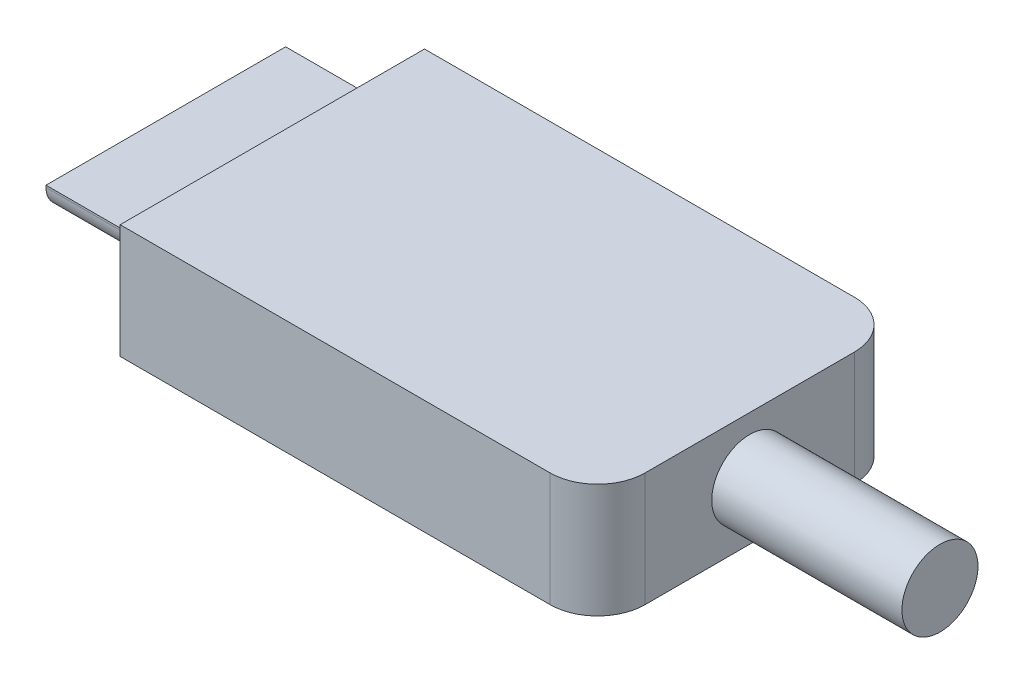
ISO-10303-21;
HEADER;
FILE_DESCRIPTION(('STEP AP214'),'2;1');
FILE_NAME('part.step','',(''),(''),'','','');
FILE_SCHEMA(('AUTOMOTIVE_DESIGN { 1 0 10303 214 1 1 1 1 }'));
ENDSEC;
DATA;
#1=APPLICATION_CONTEXT('core data for automotive mechanical design processes');
#2=APPLICATION_PROTOCOL_DEFINITION('international standard','automotive_design',2000,#1);
#3=PRODUCT_CONTEXT('',#1,'mechanical');
#4=PRODUCT('Part','Part','',(#3));
#5=PRODUCT_RELATED_PRODUCT_CATEGORY('part','',(#4));
#6=PRODUCT_DEFINITION_FORMATION('','',#4);
#7=PRODUCT_DEFINITION_CONTEXT('part definition',#1,'design');
#8=PRODUCT_DEFINITION('design','',#6,#7);
#9=PRODUCT_DEFINITION_SHAPE('','',#8);
#10=(LENGTH_UNIT() NAMED_UNIT(*) SI_UNIT(.MILLI.,.METRE.));
#11=(NAMED_UNIT(*) PLANE_ANGLE_UNIT() SI_UNIT($,.RADIAN.));
#12=(NAMED_UNIT(*) SI_UNIT($,.STERADIAN.) SOLID_ANGLE_UNIT());
#13=UNCERTAINTY_MEASURE_WITH_UNIT(LENGTH_MEASURE(1.E-05),#10,'distance_accuracy_value','');
#14=(GEOMETRIC_REPRESENTATION_CONTEXT(3) GLOBAL_UNCERTAINTY_ASSIGNED_CONTEXT((#13)) GLOBAL_UNIT_ASSIGNED_CONTEXT((#10,
#11,#12)) REPRESENTATION_CONTEXT('',''));
#15=CARTESIAN_POINT('',(0.,0.,0.));
#16=DIRECTION('',(0.,0.,1.));
#17=DIRECTION('',(1.,0.,0.));
#18=AXIS2_PLACEMENT_3D('',#15,#16,#17);
#19=CARTESIAN_POINT('',(-12.55,-3.,-8.));
#20=DIRECTION('',(-1.,0.,0.));
#21=DIRECTION('',(0.,0.,1.));
#22=AXIS2_PLACEMENT_3D('',#19,#20,#21);
#23=PLANE('',#22);
#24=DIRECTION('',(0.,1.,0.));
#25=VECTOR('',#24,1.);
#26=CARTESIAN_POINT('',(-12.55,-3.,8.));
#27=LINE('',#26,#25);
#28=CARTESIAN_POINT('',(-12.55,-3.,8.));
#29=VERTEX_POINT('',#28);
#30=CARTESIAN_POINT('',(-12.55,3.,8.));
#31=VERTEX_POINT('',#30);
#32=EDGE_CURVE('E37',#29,#31,#27,.T.);
#33=ORIENTED_EDGE('',*,*,#32,.T.);
#34=DIRECTION('',(0.,0.,1.));
#35=VECTOR('',#34,1.);
#36=CARTESIAN_POINT('',(-12.55,3.,-8.));
#37=LINE('',#36,#35);
#38=CARTESIAN_POINT('',(-12.55,3.,-8.));
#39=VERTEX_POINT('',#38);
#40=EDGE_CURVE('E400',#39,#31,#37,.T.);
#41=ORIENTED_EDGE('',*,*,#40,.F.);
#42=DIRECTION('',(0.,1.,0.));
#43=VECTOR('',#42,1.);
#44=CARTESIAN_POINT('',(-12.55,-3.,-8.));
#45=LINE('',#44,#43);
#46=CARTESIAN_POINT('',(-12.55,-3.,-8.));
#47=VERTEX_POINT('',#46);
#48=EDGE_CURVE('E11',#47,#39,#45,.T.);
#49=ORIENTED_EDGE('',*,*,#48,.F.);
#50=DIRECTION('',(0.,0.,1.));
#51=VECTOR('',#50,1.);
#52=CARTESIAN_POINT('',(-12.55,-3.,-8.));
#53=LINE('',#52,#51);
#54=EDGE_CURVE('E418',#47,#29,#53,.T.);
#55=ORIENTED_EDGE('',*,*,#54,.T.);
#56=EDGE_LOOP('',(#33,#41,#49,#55));
#57=FACE_BOUND('',#56,.T.);
#58=DIRECTION('',(0.,1.,0.));
#59=VECTOR('',#58,1.);
#60=CARTESIAN_POINT('',(-12.55,1.0446453128218,6.30000000000001));
#61=LINE('',#60,#59);
#62=CARTESIAN_POINT('',(-12.55,1.0446453128218,6.30000000000001));
#63=VERTEX_POINT('',#62);
#64=CARTESIAN_POINT('',(-12.55,1.15,6.3));
#65=VERTEX_POINT('',#64);
#66=EDGE_CURVE('E347',#63,#65,#61,.T.);
#67=ORIENTED_EDGE('',*,*,#66,.F.);
#68=CARTESIAN_POINT('',(-12.55,1.0446453128218,5.1));
#69=DIRECTION('',(-1.,0.,0.));
#70=DIRECTION('',(0.,0.,-1.));
#71=AXIS2_PLACEMENT_3D('',#68,#69,#70);
#72=CIRCLE('',#71,1.2);
#73=CARTESIAN_POINT('',(-12.55,0.196117175397943,5.94852813742386));
#74=VERTEX_POINT('',#73);
#75=EDGE_CURVE('E244',#74,#63,#72,.T.);
#76=ORIENTED_EDGE('',*,*,#75,.F.);
#77=DIRECTION('',(0.,0.707106781186547,0.707106781186548));
#78=VECTOR('',#77,1.);
#79=CARTESIAN_POINT('',(-12.55,-0.798528137423859,4.95388282460206));
#80=LINE('',#79,#78);
#81=CARTESIAN_POINT('',(-12.55,-0.798528137423855,4.95388282460206));
#82=VERTEX_POINT('',#81);
#83=EDGE_CURVE('E322',#82,#74,#80,.T.);
#84=ORIENTED_EDGE('',*,*,#83,.F.);
#85=CARTESIAN_POINT('',(-12.55,0.0499999999999997,4.1053546871782));
#86=DIRECTION('',(-1.,0.,0.));
#87=DIRECTION('',(0.,0.,-1.));
#88=AXIS2_PLACEMENT_3D('',#85,#86,#87);
#89=CIRCLE('',#88,1.2);
#90=CARTESIAN_POINT('',(-12.55,-1.15,4.1053546871782));
#91=VERTEX_POINT('',#90);
#92=EDGE_CURVE('E365',#91,#82,#89,.T.);
#93=ORIENTED_EDGE('',*,*,#92,.F.);
#94=DIRECTION('',(0.,0.,1.));
#95=VECTOR('',#94,1.);
#96=CARTESIAN_POINT('',(-12.55,-1.15,0.912741699796952));
#97=LINE('',#96,#95);
#98=CARTESIAN_POINT('',(-12.55,-1.15,0.912741699796952));
#99=VERTEX_POINT('',#98);
#100=EDGE_CURVE('E363',#99,#91,#97,.T.);
#101=ORIENTED_EDGE('',*,*,#100,.F.);
#102=CARTESIAN_POINT('',(-12.55,0.0499999999999988,0.912741699796952));
#103=DIRECTION('',(-1.,0.,0.));
#104=DIRECTION('',(0.,0.,-1.));
#105=AXIS2_PLACEMENT_3D('',#102,#103,#104);
#106=CIRCLE('',#105,1.2);
#107=CARTESIAN_POINT('',(-12.55,-0.798528137423859,0.0642135623730962));
#108=VERTEX_POINT('',#107);
#109=EDGE_CURVE('E361',#108,#99,#106,.T.);
#110=ORIENTED_EDGE('',*,*,#109,.F.);
#111=DIRECTION('',(0.,-0.707106781186547,0.707106781186548));
#112=VECTOR('',#111,1.);
#113=CARTESIAN_POINT('',(-12.55,-0.798528137423859,0.0642135623730962));
#114=LINE('',#113,#112);
#115=CARTESIAN_POINT('',(-12.55,-0.057322330470338,-0.676992244580426));
#116=VERTEX_POINT('',#115);
#117=EDGE_CURVE('E359',#116,#108,#114,.T.);
#118=ORIENTED_EDGE('',*,*,#117,.F.);
#119=CARTESIAN_POINT('',(-12.55,-0.605330085889914,-1.225));
#120=DIRECTION('',(1.,0.,0.));
#121=DIRECTION('',(0.,0.,-1.));
#122=AXIS2_PLACEMENT_3D('',#119,#120,#121);
#123=CIRCLE('',#122,0.775);
#124=CARTESIAN_POINT('',(-12.55,-0.605330085889914,-2.));
#125=VERTEX_POINT('',#124);
#126=EDGE_CURVE('E357',#125,#116,#123,.T.);
#127=ORIENTED_EDGE('',*,*,#126,.F.);
#128=DIRECTION('',(0.,1.,0.));
#129=VECTOR('',#128,1.);
#130=CARTESIAN_POINT('',(-12.55,-1.15,-2.));
#131=LINE('',#130,#129);
#132=CARTESIAN_POINT('',(-12.55,-1.15,-2.));
#133=VERTEX_POINT('',#132);
#134=EDGE_CURVE('E355',#133,#125,#131,.T.);
#135=ORIENTED_EDGE('',*,*,#134,.F.);
#136=DIRECTION('',(0.,0.,1.));
#137=VECTOR('',#136,1.);
#138=CARTESIAN_POINT('',(-12.55,-1.15,-6.3));
#139=LINE('',#138,#137);
#140=CARTESIAN_POINT('',(-12.55,-1.15,-6.3));
#141=VERTEX_POINT('',#140);
#142=EDGE_CURVE('E353',#141,#133,#139,.T.);
#143=ORIENTED_EDGE('',*,*,#142,.F.);
#144=DIRECTION('',(0.,-1.,0.));
#145=VECTOR('',#144,1.);
#146=CARTESIAN_POINT('',(-12.55,1.15,-6.3));
#147=LINE('',#146,#145);
#148=CARTESIAN_POINT('',(-12.55,1.15,-6.3));
#149=VERTEX_POINT('',#148);
#150=EDGE_CURVE('E351',#149,#141,#147,.T.);
#151=ORIENTED_EDGE('',*,*,#150,.F.);
#152=DIRECTION('',(0.,0.,-1.));
#153=VECTOR('',#152,1.);
#154=CARTESIAN_POINT('',(-12.55,1.15,6.3));
#155=LINE('',#154,#153);
#156=EDGE_CURVE('E349',#65,#149,#155,.T.);
#157=ORIENTED_EDGE('',*,*,#156,.F.);
#158=EDGE_LOOP('',(#67,#76,#84,#93,#101,#110,#118,#127,#135,#143,#151,#157));
#159=FACE_BOUND('',#158,.T.);
#160=ADVANCED_FACE('F33',(#57,#159),#23,.T.);
#161=CARTESIAN_POINT('',(-12.55,-3.,-8.));
#162=DIRECTION('',(0.,0.,-1.));
#163=DIRECTION('',(-1.,0.,0.));
#164=AXIS2_PLACEMENT_3D('',#161,#162,#163);
#165=PLANE('',#164);
#166=ORIENTED_EDGE('',*,*,#48,.T.);
#167=DIRECTION('',(-1.,0.,0.));
#168=VECTOR('',#167,1.);
#169=CARTESIAN_POINT('',(-12.55,3.,-8.));
#170=LINE('',#169,#168);
#171=CARTESIAN_POINT('',(10.05,3.,-8.));
#172=VERTEX_POINT('',#171);
#173=EDGE_CURVE('E415',#172,#39,#170,.T.);
#174=ORIENTED_EDGE('',*,*,#173,.F.);
#175=DIRECTION('',(0.,1.,0.));
#176=VECTOR('',#175,1.);
#177=CARTESIAN_POINT('',(10.05,-3.,-8.));
#178=LINE('',#177,#176);
#179=CARTESIAN_POINT('',(10.05,-3.,-8.));
#180=VERTEX_POINT('',#179);
#181=EDGE_CURVE('E42',#180,#172,#178,.T.);
#182=ORIENTED_EDGE('',*,*,#181,.F.);
#183=DIRECTION('',(-1.,0.,0.));
#184=VECTOR('',#183,1.);
#185=CARTESIAN_POINT('',(-12.55,-3.,-8.));
#186=LINE('',#185,#184);
#187=EDGE_CURVE('E433',#180,#47,#186,.T.);
#188=ORIENTED_EDGE('',*,*,#187,.T.);
#189=EDGE_LOOP('',(#166,#174,#182,#188));
#190=FACE_BOUND('',#189,.T.);
#191=ADVANCED_FACE('F455',(#190),#165,.T.);
#192=CARTESIAN_POINT('',(10.05,-3.,-5.5));
#193=DIRECTION('',(0.,1.,0.));
#194=DIRECTION('',(0.,0.,1.));
#195=AXIS2_PLACEMENT_3D('',#192,#193,#194);
#196=CYLINDRICAL_SURFACE('',#195,2.5);
#197=ORIENTED_EDGE('',*,*,#181,.T.);
#198=CARTESIAN_POINT('',(10.05,3.,-5.5));
#199=DIRECTION('',(0.,1.,0.));
#200=DIRECTION('',(0.,0.,-1.));
#201=AXIS2_PLACEMENT_3D('',#198,#199,#200);
#202=CIRCLE('',#201,2.5);
#203=CARTESIAN_POINT('',(12.55,3.,-5.5));
#204=VERTEX_POINT('',#203);
#205=EDGE_CURVE('E412',#204,#172,#202,.T.);
#206=ORIENTED_EDGE('',*,*,#205,.F.);
#207=DIRECTION('',(0.,1.,0.));
#208=VECTOR('',#207,1.);
#209=CARTESIAN_POINT('',(12.55,-3.,-5.5));
#210=LINE('',#209,#208);
#211=CARTESIAN_POINT('',(12.55,-3.,-5.5));
#212=VERTEX_POINT('',#211);
#213=EDGE_CURVE('E437',#212,#204,#210,.T.);
#214=ORIENTED_EDGE('',*,*,#213,.F.);
#215=CARTESIAN_POINT('',(10.05,-3.,-5.5));
#216=DIRECTION('',(0.,1.,0.));
#217=DIRECTION('',(0.,0.,-1.));
#218=AXIS2_PLACEMENT_3D('',#215,#216,#217);
#219=CIRCLE('',#218,2.5);
#220=EDGE_CURVE('E430',#212,#180,#219,.T.);
#221=ORIENTED_EDGE('',*,*,#220,.T.);
#222=EDGE_LOOP('',(#197,#206,#214,#221));
#223=FACE_BOUND('',#222,.T.);
#224=ADVANCED_FACE('F468',(#223),#196,.T.);
#225=CARTESIAN_POINT('',(12.55,-3.,-5.5));
#226=DIRECTION('',(1.,0.,0.));
#227=DIRECTION('',(0.,0.,-1.));
#228=AXIS2_PLACEMENT_3D('',#225,#226,#227);
#229=PLANE('',#228);
#230=CARTESIAN_POINT('',(12.55,0.,0.));
#231=DIRECTION('',(1.,0.,0.));
#232=DIRECTION('',(0.,0.,-1.));
#233=AXIS2_PLACEMENT_3D('',#230,#231,#232);
#234=CIRCLE('',#233,2.);
#235=CARTESIAN_POINT('',(12.55,0.,-2.));
#236=VERTEX_POINT('',#235);
#237=EDGE_CURVE('E624',#236,#236,#234,.T.);
#238=ORIENTED_EDGE('',*,*,#237,.F.);
#239=EDGE_LOOP('',(#238));
#240=FACE_BOUND('',#239,.T.);
#241=ORIENTED_EDGE('',*,*,#213,.T.);
#242=DIRECTION('',(0.,0.,-1.));
#243=VECTOR('',#242,1.);
#244=CARTESIAN_POINT('',(12.55,3.,-5.5));
#245=LINE('',#244,#243);
#246=CARTESIAN_POINT('',(12.55,3.,5.5));
#247=VERTEX_POINT('',#246);
#248=EDGE_CURVE('E409',#247,#204,#245,.T.);
#249=ORIENTED_EDGE('',*,*,#248,.F.);
#250=DIRECTION('',(0.,1.,0.));
#251=VECTOR('',#250,1.);
#252=CARTESIAN_POINT('',(12.55,-3.,5.5));
#253=LINE('',#252,#251);
#254=CARTESIAN_POINT('',(12.55,-3.,5.5));
#255=VERTEX_POINT('',#254);
#256=EDGE_CURVE('E439',#255,#247,#253,.T.);
#257=ORIENTED_EDGE('',*,*,#256,.F.);
#258=DIRECTION('',(0.,0.,-1.));
#259=VECTOR('',#258,1.);
#260=CARTESIAN_POINT('',(12.55,-3.,-5.5));
#261=LINE('',#260,#259);
#262=EDGE_CURVE('E427',#255,#212,#261,.T.);
#263=ORIENTED_EDGE('',*,*,#262,.T.);
#264=EDGE_LOOP('',(#241,#249,#257,#263));
#265=FACE_BOUND('',#264,.T.);
#266=ADVANCED_FACE('F466',(#240,#265),#229,.T.);
#267=CARTESIAN_POINT('',(10.05,-3.,5.5));
#268=DIRECTION('',(0.,1.,0.));
#269=DIRECTION('',(0.,0.,1.));
#270=AXIS2_PLACEMENT_3D('',#267,#268,#269);
#271=CYLINDRICAL_SURFACE('',#270,2.5);
#272=ORIENTED_EDGE('',*,*,#256,.T.);
#273=CARTESIAN_POINT('',(10.05,3.,5.5));
#274=DIRECTION('',(0.,1.,0.));
#275=DIRECTION('',(0.,0.,1.));
#276=AXIS2_PLACEMENT_3D('',#273,#274,#275);
#277=CIRCLE('',#276,2.5);
#278=CARTESIAN_POINT('',(10.05,3.,8.));
#279=VERTEX_POINT('',#278);
#280=EDGE_CURVE('E406',#279,#247,#277,.T.);
#281=ORIENTED_EDGE('',*,*,#280,.F.);
#282=DIRECTION('',(0.,1.,0.));
#283=VECTOR('',#282,1.);
#284=CARTESIAN_POINT('',(10.05,-3.,8.));
#285=LINE('',#284,#283);
#286=CARTESIAN_POINT('',(10.05,-3.,8.));
#287=VERTEX_POINT('',#286);
#288=EDGE_CURVE('E440',#287,#279,#285,.T.);
#289=ORIENTED_EDGE('',*,*,#288,.F.);
#290=CARTESIAN_POINT('',(10.05,-3.,5.5));
#291=DIRECTION('',(0.,1.,0.));
#292=DIRECTION('',(0.,0.,1.));
#293=AXIS2_PLACEMENT_3D('',#290,#291,#292);
#294=CIRCLE('',#293,2.5);
#295=EDGE_CURVE('E424',#287,#255,#294,.T.);
#296=ORIENTED_EDGE('',*,*,#295,.T.);
#297=EDGE_LOOP('',(#272,#281,#289,#296));
#298=FACE_BOUND('',#297,.T.);
#299=ADVANCED_FACE('F463',(#298),#271,.T.);
#300=CARTESIAN_POINT('',(-12.55,-3.,8.));
#301=DIRECTION('',(0.,0.,1.));
#302=DIRECTION('',(1.,0.,0.));
#303=AXIS2_PLACEMENT_3D('',#300,#301,#302);
#304=PLANE('',#303);
#305=ORIENTED_EDGE('',*,*,#288,.T.);
#306=DIRECTION('',(1.,0.,0.));
#307=VECTOR('',#306,1.);
#308=CARTESIAN_POINT('',(-12.55,3.,8.));
#309=LINE('',#308,#307);
#310=EDGE_CURVE('E403',#31,#279,#309,.T.);
#311=ORIENTED_EDGE('',*,*,#310,.F.);
#312=ORIENTED_EDGE('',*,*,#32,.F.);
#313=DIRECTION('',(1.,0.,0.));
#314=VECTOR('',#313,1.);
#315=CARTESIAN_POINT('',(-12.55,-3.,8.));
#316=LINE('',#315,#314);
#317=EDGE_CURVE('E421',#29,#287,#316,.T.);
#318=ORIENTED_EDGE('',*,*,#317,.T.);
#319=EDGE_LOOP('',(#305,#311,#312,#318));
#320=FACE_BOUND('',#319,.T.);
#321=ADVANCED_FACE('F448',(#320),#304,.T.);
#322=CARTESIAN_POINT('',(10.05,-3.,5.5));
#323=DIRECTION('',(0.,1.,0.));
#324=DIRECTION('',(0.,0.,1.));
#325=AXIS2_PLACEMENT_3D('',#322,#323,#324);
#326=PLANE('',#325);
#327=ORIENTED_EDGE('',*,*,#54,.F.);
#328=ORIENTED_EDGE('',*,*,#187,.F.);
#329=ORIENTED_EDGE('',*,*,#220,.F.);
#330=ORIENTED_EDGE('',*,*,#262,.F.);
#331=ORIENTED_EDGE('',*,*,#295,.F.);
#332=ORIENTED_EDGE('',*,*,#317,.F.);
#333=EDGE_LOOP('',(#327,#328,#329,#330,#331,#332));
#334=FACE_BOUND('',#333,.T.);
#335=ADVANCED_FACE('F458',(#334),#326,.F.);
#336=CARTESIAN_POINT('',(10.05,3.,5.5));
#337=DIRECTION('',(0.,1.,0.));
#338=DIRECTION('',(0.,0.,1.));
#339=AXIS2_PLACEMENT_3D('',#336,#337,#338);
#340=PLANE('',#339);
#341=ORIENTED_EDGE('',*,*,#40,.T.);
#342=ORIENTED_EDGE('',*,*,#310,.T.);
#343=ORIENTED_EDGE('',*,*,#280,.T.);
#344=ORIENTED_EDGE('',*,*,#248,.T.);
#345=ORIENTED_EDGE('',*,*,#205,.T.);
#346=ORIENTED_EDGE('',*,*,#173,.T.);
#347=EDGE_LOOP('',(#341,#342,#343,#344,#345,#346));
#348=FACE_BOUND('',#347,.T.);
#349=ADVANCED_FACE('F451',(#348),#340,.T.);
#350=CARTESIAN_POINT('',(-18.15,1.0446453128218,5.1));
#351=DIRECTION('',(1.,0.,0.));
#352=DIRECTION('',(0.,0.,-1.));
#353=AXIS2_PLACEMENT_3D('',#350,#351,#352);
#354=PLANE('',#353);
#355=CARTESIAN_POINT('',(-18.15,1.0446453128218,5.1));
#356=DIRECTION('',(-1.,0.,0.));
#357=DIRECTION('',(0.,0.,-1.));
#358=AXIS2_PLACEMENT_3D('',#355,#356,#357);
#359=CIRCLE('',#358,1.2);
#360=CARTESIAN_POINT('',(-18.15,0.196117175397943,5.94852813742386));
#361=VERTEX_POINT('',#360);
#362=CARTESIAN_POINT('',(-18.15,1.0446453128218,6.30000000000001));
#363=VERTEX_POINT('',#362);
#364=EDGE_CURVE('E318',#361,#363,#359,.T.);
#365=ORIENTED_EDGE('',*,*,#364,.T.);
#366=DIRECTION('',(0.,1.,0.));
#367=VECTOR('',#366,1.);
#368=CARTESIAN_POINT('',(-18.15,1.0446453128218,6.30000000000001));
#369=LINE('',#368,#367);
#370=CARTESIAN_POINT('',(-18.15,1.15,6.30000000000001));
#371=VERTEX_POINT('',#370);
#372=EDGE_CURVE('E321',#363,#371,#369,.T.);
#373=ORIENTED_EDGE('',*,*,#372,.T.);
#374=DIRECTION('',(0.,0.,-1.));
#375=VECTOR('',#374,1.);
#376=CARTESIAN_POINT('',(-18.15,1.15,6.30000000000001));
#377=LINE('',#376,#375);
#378=CARTESIAN_POINT('',(-18.15,1.15,-6.3));
#379=VERTEX_POINT('',#378);
#380=EDGE_CURVE('E324',#371,#379,#377,.T.);
#381=ORIENTED_EDGE('',*,*,#380,.T.);
#382=DIRECTION('',(0.,-1.,0.));
#383=VECTOR('',#382,1.);
#384=CARTESIAN_POINT('',(-18.15,1.15,-6.3));
#385=LINE('',#384,#383);
#386=CARTESIAN_POINT('',(-18.15,-1.15,-6.3));
#387=VERTEX_POINT('',#386);
#388=EDGE_CURVE('E326',#379,#387,#385,.T.);
#389=ORIENTED_EDGE('',*,*,#388,.T.);
#390=DIRECTION('',(0.,0.,1.));
#391=VECTOR('',#390,1.);
#392=CARTESIAN_POINT('',(-18.15,-1.15,-6.3));
#393=LINE('',#392,#391);
#394=CARTESIAN_POINT('',(-18.15,-1.15,-2.));
#395=VERTEX_POINT('',#394);
#396=EDGE_CURVE('E328',#387,#395,#393,.T.);
#397=ORIENTED_EDGE('',*,*,#396,.T.);
#398=DIRECTION('',(0.,1.,0.));
#399=VECTOR('',#398,1.);
#400=CARTESIAN_POINT('',(-18.15,-1.15,-2.));
#401=LINE('',#400,#399);
#402=CARTESIAN_POINT('',(-18.15,-0.605330085889914,-2.));
#403=VERTEX_POINT('',#402);
#404=EDGE_CURVE('E330',#395,#403,#401,.T.);
#405=ORIENTED_EDGE('',*,*,#404,.T.);
#406=CARTESIAN_POINT('',(-18.15,-0.605330085889914,-1.225));
#407=DIRECTION('',(1.,0.,0.));
#408=DIRECTION('',(0.,0.,-1.));
#409=AXIS2_PLACEMENT_3D('',#406,#407,#408);
#410=CIRCLE('',#409,0.775);
#411=CARTESIAN_POINT('',(-18.15,-0.057322330470338,-0.676992244580425));
#412=VERTEX_POINT('',#411);
#413=EDGE_CURVE('E332',#403,#412,#410,.T.);
#414=ORIENTED_EDGE('',*,*,#413,.T.);
#415=DIRECTION('',(0.,-0.707106781186547,0.707106781186548));
#416=VECTOR('',#415,1.);
#417=CARTESIAN_POINT('',(-18.15,-0.798528137423859,0.0642135623730974));
#418=LINE('',#417,#416);
#419=CARTESIAN_POINT('',(-18.15,-0.798528137423859,0.0642135623730974));
#420=VERTEX_POINT('',#419);
#421=EDGE_CURVE('E334',#412,#420,#418,.T.);
#422=ORIENTED_EDGE('',*,*,#421,.T.);
#423=CARTESIAN_POINT('',(-18.15,0.0499999999999988,0.912741699796953));
#424=DIRECTION('',(-1.,0.,0.));
#425=DIRECTION('',(0.,0.,-1.));
#426=AXIS2_PLACEMENT_3D('',#423,#424,#425);
#427=CIRCLE('',#426,1.2);
#428=CARTESIAN_POINT('',(-18.15,-1.15,0.912741699796954));
#429=VERTEX_POINT('',#428);
#430=EDGE_CURVE('E336',#420,#429,#427,.T.);
#431=ORIENTED_EDGE('',*,*,#430,.T.);
#432=DIRECTION('',(0.,0.,1.));
#433=VECTOR('',#432,1.);
#434=CARTESIAN_POINT('',(-18.15,-1.15,0.912741699796954));
#435=LINE('',#434,#433);
#436=CARTESIAN_POINT('',(-18.15,-1.15,4.1053546871782));
#437=VERTEX_POINT('',#436);
#438=EDGE_CURVE('E338',#429,#437,#435,.T.);
#439=ORIENTED_EDGE('',*,*,#438,.T.);
#440=CARTESIAN_POINT('',(-18.15,0.0499999999999997,4.1053546871782));
#441=DIRECTION('',(-1.,0.,0.));
#442=DIRECTION('',(0.,0.,-1.));
#443=AXIS2_PLACEMENT_3D('',#440,#441,#442);
#444=CIRCLE('',#443,1.2);
#445=CARTESIAN_POINT('',(-18.15,-0.798528137423858,4.95388282460206));
#446=VERTEX_POINT('',#445);
#447=EDGE_CURVE('E340',#437,#446,#444,.T.);
#448=ORIENTED_EDGE('',*,*,#447,.T.);
#449=DIRECTION('',(0.,0.707106781186547,0.707106781186548));
#450=VECTOR('',#449,1.);
#451=CARTESIAN_POINT('',(-18.15,-0.798528137423859,4.95388282460206));
#452=LINE('',#451,#450);
#453=EDGE_CURVE('E342',#446,#361,#452,.T.);
#454=ORIENTED_EDGE('',*,*,#453,.T.);
#455=EDGE_LOOP('',(#365,#373,#381,#389,#397,#405,#414,#422,#431,#439,#448,#454));
#456=FACE_BOUND('',#455,.T.);
#457=CARTESIAN_POINT('',(-18.15,1.0446453128218,5.1));
#458=DIRECTION('',(-1.,0.,0.));
#459=DIRECTION('',(0.,0.,-1.));
#460=AXIS2_PLACEMENT_3D('',#457,#458,#459);
#461=CIRCLE('',#460,1.);
#462=CARTESIAN_POINT('',(-18.15,0.337538531635248,5.80710678118655));
#463=VERTEX_POINT('',#462);
#464=CARTESIAN_POINT('',(-18.15,0.95,6.09551105707615));
#465=VERTEX_POINT('',#464);
#466=EDGE_CURVE('E227',#463,#465,#461,.T.);
#467=ORIENTED_EDGE('',*,*,#466,.F.);
#468=DIRECTION('',(0.,0.707106781186547,0.707106781186548));
#469=VECTOR('',#468,1.);
#470=CARTESIAN_POINT('',(-18.15,-0.657106781186552,4.81246146836475));
#471=LINE('',#470,#469);
#472=CARTESIAN_POINT('',(-18.15,-0.657106781186552,4.81246146836475));
#473=VERTEX_POINT('',#472);
#474=EDGE_CURVE('E270',#473,#463,#471,.T.);
#475=ORIENTED_EDGE('',*,*,#474,.F.);
#476=CARTESIAN_POINT('',(-18.15,0.0499999999999997,4.1053546871782));
#477=DIRECTION('',(-1.,0.,0.));
#478=DIRECTION('',(0.,0.,-1.));
#479=AXIS2_PLACEMENT_3D('',#476,#477,#478);
#480=CIRCLE('',#479,1.);
#481=CARTESIAN_POINT('',(-18.15,-0.950000000000002,4.1053546871782));
#482=VERTEX_POINT('',#481);
#483=EDGE_CURVE('E267',#482,#473,#480,.T.);
#484=ORIENTED_EDGE('',*,*,#483,.F.);
#485=DIRECTION('',(0.,0.,1.));
#486=VECTOR('',#485,1.);
#487=CARTESIAN_POINT('',(-18.15,-0.950000000000001,0.912741699796954));
#488=LINE('',#487,#486);
#489=CARTESIAN_POINT('',(-18.15,-0.950000000000001,0.912741699796954));
#490=VERTEX_POINT('',#489);
#491=EDGE_CURVE('E265',#490,#482,#488,.T.);
#492=ORIENTED_EDGE('',*,*,#491,.F.);
#493=CARTESIAN_POINT('',(-18.15,0.0499999999999988,0.912741699796953));
#494=DIRECTION('',(-1.,0.,0.));
#495=DIRECTION('',(0.,0.,-1.));
#496=AXIS2_PLACEMENT_3D('',#493,#494,#495);
#497=CIRCLE('',#496,1.);
#498=CARTESIAN_POINT('',(-18.15,-0.657106781186554,0.205634918610411));
#499=VERTEX_POINT('',#498);
#500=EDGE_CURVE('E263',#499,#490,#497,.T.);
#501=ORIENTED_EDGE('',*,*,#500,.F.);
#502=DIRECTION('',(0.,-0.707106781186547,0.707106781186548));
#503=VECTOR('',#502,1.);
#504=CARTESIAN_POINT('',(-18.15,-0.657106781186554,0.205634918610411));
#505=LINE('',#504,#503);
#506=CARTESIAN_POINT('',(-18.15,0.0840990257669761,-0.53557088834312));
#507=VERTEX_POINT('',#506);
#508=EDGE_CURVE('E261',#507,#499,#505,.T.);
#509=ORIENTED_EDGE('',*,*,#508,.F.);
#510=CARTESIAN_POINT('',(-18.15,-0.605330085889914,-1.225));
#511=DIRECTION('',(1.,0.,0.));
#512=DIRECTION('',(0.,0.,-1.));
#513=AXIS2_PLACEMENT_3D('',#510,#511,#512);
#514=CIRCLE('',#513,0.975);
#515=CARTESIAN_POINT('',(-18.15,-0.605330085889914,-2.2));
#516=VERTEX_POINT('',#515);
#517=EDGE_CURVE('E259',#516,#507,#514,.T.);
#518=ORIENTED_EDGE('',*,*,#517,.F.);
#519=DIRECTION('',(0.,1.,0.));
#520=VECTOR('',#519,1.);
#521=CARTESIAN_POINT('',(-18.15,-0.950000000000001,-2.2));
#522=LINE('',#521,#520);
#523=CARTESIAN_POINT('',(-18.15,-0.950000000000001,-2.2));
#524=VERTEX_POINT('',#523);
#525=EDGE_CURVE('E257',#524,#516,#522,.T.);
#526=ORIENTED_EDGE('',*,*,#525,.F.);
#527=DIRECTION('',(0.,0.,1.));
#528=VECTOR('',#527,1.);
#529=CARTESIAN_POINT('',(-18.15,-0.950000000000001,-6.1));
#530=LINE('',#529,#528);
#531=CARTESIAN_POINT('',(-18.15,-0.950000000000001,-6.1));
#532=VERTEX_POINT('',#531);
#533=EDGE_CURVE('E252',#532,#524,#530,.T.);
#534=ORIENTED_EDGE('',*,*,#533,.F.);
#535=DIRECTION('',(0.,-1.,0.));
#536=VECTOR('',#535,1.);
#537=CARTESIAN_POINT('',(-18.15,0.95,-6.1));
#538=LINE('',#537,#536);
#539=CARTESIAN_POINT('',(-18.15,0.95,-6.1));
#540=VERTEX_POINT('',#539);
#541=EDGE_CURVE('E250',#540,#532,#538,.T.);
#542=ORIENTED_EDGE('',*,*,#541,.F.);
#543=DIRECTION('',(0.,0.,-1.));
#544=VECTOR('',#543,1.);
#545=CARTESIAN_POINT('',(-18.15,0.95,6.09551105707615));
#546=LINE('',#545,#544);
#547=EDGE_CURVE('E236',#465,#540,#546,.T.);
#548=ORIENTED_EDGE('',*,*,#547,.F.);
#549=EDGE_LOOP('',(#467,#475,#484,#492,#501,#509,#518,#526,#534,#542,#548));
#550=FACE_BOUND('',#549,.T.);
#551=ADVANCED_FACE('F248',(#456,#550),#354,.F.);
#552=CARTESIAN_POINT('',(-18.15,1.0446453128218,5.1));
#553=DIRECTION('',(1.,0.,0.));
#554=DIRECTION('',(0.,0.,-1.));
#555=AXIS2_PLACEMENT_3D('',#552,#553,#554);
#556=CYLINDRICAL_SURFACE('',#555,1.2);
#557=ORIENTED_EDGE('',*,*,#75,.T.);
#558=DIRECTION('',(1.,0.,0.));
#559=VECTOR('',#558,1.);
#560=CARTESIAN_POINT('',(-18.15,1.0446453128218,6.30000000000001));
#561=LINE('',#560,#559);
#562=EDGE_CURVE('E398',#363,#63,#561,.T.);
#563=ORIENTED_EDGE('',*,*,#562,.F.);
#564=ORIENTED_EDGE('',*,*,#364,.F.);
#565=DIRECTION('',(1.,0.,0.));
#566=VECTOR('',#565,1.);
#567=CARTESIAN_POINT('',(-18.15,0.196117175397943,5.94852813742386));
#568=LINE('',#567,#566);
#569=EDGE_CURVE('E344',#361,#74,#568,.T.);
#570=ORIENTED_EDGE('',*,*,#569,.T.);
#571=EDGE_LOOP('',(#557,#563,#564,#570));
#572=FACE_BOUND('',#571,.T.);
#573=ADVANCED_FACE('F537',(#572),#556,.T.);
#574=CARTESIAN_POINT('',(-18.15,1.0446453128218,6.30000000000001));
#575=DIRECTION('',(0.,0.,-1.));
#576=DIRECTION('',(0.,1.,0.));
#577=AXIS2_PLACEMENT_3D('',#574,#575,#576);
#578=PLANE('',#577);
#579=ORIENTED_EDGE('',*,*,#66,.T.);
#580=DIRECTION('',(1.,0.,0.));
#581=VECTOR('',#580,1.);
#582=CARTESIAN_POINT('',(-18.15,1.15,6.30000000000001));
#583=LINE('',#582,#581);
#584=EDGE_CURVE('E395',#371,#65,#583,.T.);
#585=ORIENTED_EDGE('',*,*,#584,.F.);
#586=ORIENTED_EDGE('',*,*,#372,.F.);
#587=ORIENTED_EDGE('',*,*,#562,.T.);
#588=EDGE_LOOP('',(#579,#585,#586,#587));
#589=FACE_BOUND('',#588,.T.);
#590=ADVANCED_FACE('F576',(#589),#578,.F.);
#591=CARTESIAN_POINT('',(-18.15,1.15,6.30000000000001));
#592=DIRECTION('',(0.,-1.,0.));
#593=DIRECTION('',(0.,0.,-1.));
#594=AXIS2_PLACEMENT_3D('',#591,#592,#593);
#595=PLANE('',#594);
#596=ORIENTED_EDGE('',*,*,#156,.T.);
#597=DIRECTION('',(1.,0.,0.));
#598=VECTOR('',#597,1.);
#599=CARTESIAN_POINT('',(-18.15,1.15,-6.3));
#600=LINE('',#599,#598);
#601=EDGE_CURVE('E392',#379,#149,#600,.T.);
#602=ORIENTED_EDGE('',*,*,#601,.F.);
#603=ORIENTED_EDGE('',*,*,#380,.F.);
#604=ORIENTED_EDGE('',*,*,#584,.T.);
#605=EDGE_LOOP('',(#596,#602,#603,#604));
#606=FACE_BOUND('',#605,.T.);
#607=ADVANCED_FACE('F572',(#606),#595,.F.);
#608=CARTESIAN_POINT('',(-18.15,1.15,-6.3));
#609=DIRECTION('',(0.,0.,1.));
#610=DIRECTION('',(1.,0.,0.));
#611=AXIS2_PLACEMENT_3D('',#608,#609,#610);
#612=PLANE('',#611);
#613=ORIENTED_EDGE('',*,*,#150,.T.);
#614=DIRECTION('',(1.,0.,0.));
#615=VECTOR('',#614,1.);
#616=CARTESIAN_POINT('',(-18.15,-1.15,-6.3));
#617=LINE('',#616,#615);
#618=EDGE_CURVE('E389',#387,#141,#617,.T.);
#619=ORIENTED_EDGE('',*,*,#618,.F.);
#620=ORIENTED_EDGE('',*,*,#388,.F.);
#621=ORIENTED_EDGE('',*,*,#601,.T.);
#622=EDGE_LOOP('',(#613,#619,#620,#621));
#623=FACE_BOUND('',#622,.T.);
#624=ADVANCED_FACE('F568',(#623),#612,.F.);
#625=CARTESIAN_POINT('',(-18.15,-1.15,-6.3));
#626=DIRECTION('',(0.,1.,0.));
#627=DIRECTION('',(0.,0.,1.));
#628=AXIS2_PLACEMENT_3D('',#625,#626,#627);
#629=PLANE('',#628);
#630=ORIENTED_EDGE('',*,*,#142,.T.);
#631=DIRECTION('',(1.,0.,0.));
#632=VECTOR('',#631,1.);
#633=CARTESIAN_POINT('',(-18.15,-1.15,-2.));
#634=LINE('',#633,#632);
#635=EDGE_CURVE('E386',#395,#133,#634,.T.);
#636=ORIENTED_EDGE('',*,*,#635,.F.);
#637=ORIENTED_EDGE('',*,*,#396,.F.);
#638=ORIENTED_EDGE('',*,*,#618,.T.);
#639=EDGE_LOOP('',(#630,#636,#637,#638));
#640=FACE_BOUND('',#639,.T.);
#641=ADVANCED_FACE('F564',(#640),#629,.F.);
#642=CARTESIAN_POINT('',(-18.15,-1.15,-2.));
#643=DIRECTION('',(0.,0.,-1.));
#644=DIRECTION('',(-1.,0.,0.));
#645=AXIS2_PLACEMENT_3D('',#642,#643,#644);
#646=PLANE('',#645);
#647=ORIENTED_EDGE('',*,*,#134,.T.);
#648=DIRECTION('',(1.,0.,0.));
#649=VECTOR('',#648,1.);
#650=CARTESIAN_POINT('',(-18.15,-0.605330085889914,-2.));
#651=LINE('',#650,#649);
#652=EDGE_CURVE('E383',#403,#125,#651,.T.);
#653=ORIENTED_EDGE('',*,*,#652,.F.);
#654=ORIENTED_EDGE('',*,*,#404,.F.);
#655=ORIENTED_EDGE('',*,*,#635,.T.);
#656=EDGE_LOOP('',(#647,#653,#654,#655));
#657=FACE_BOUND('',#656,.T.);
#658=ADVANCED_FACE('F560',(#657),#646,.F.);
#659=CARTESIAN_POINT('',(-18.15,-0.605330085889914,-1.225));
#660=DIRECTION('',(1.,0.,0.));
#661=DIRECTION('',(0.,0.,-1.));
#662=AXIS2_PLACEMENT_3D('',#659,#660,#661);
#663=CYLINDRICAL_SURFACE('',#662,0.775);
#664=ORIENTED_EDGE('',*,*,#126,.T.);
#665=DIRECTION('',(1.,0.,0.));
#666=VECTOR('',#665,1.);
#667=CARTESIAN_POINT('',(-18.15,-0.057322330470338,-0.676992244580425));
#668=LINE('',#667,#666);
#669=EDGE_CURVE('E380',#412,#116,#668,.T.);
#670=ORIENTED_EDGE('',*,*,#669,.F.);
#671=ORIENTED_EDGE('',*,*,#413,.F.);
#672=ORIENTED_EDGE('',*,*,#652,.T.);
#673=EDGE_LOOP('',(#664,#670,#671,#672));
#674=FACE_BOUND('',#673,.T.);
#675=ADVANCED_FACE('F556',(#674),#663,.F.);
#676=CARTESIAN_POINT('',(-18.15,-0.798528137423859,0.0642135623730974));
#677=DIRECTION('',(0.,0.707106781186548,0.707106781186547));
#678=DIRECTION('',(0.,-0.707106781186547,0.707106781186548));
#679=AXIS2_PLACEMENT_3D('',#676,#677,#678);
#680=PLANE('',#679);
#681=ORIENTED_EDGE('',*,*,#117,.T.);
#682=DIRECTION('',(1.,0.,0.));
#683=VECTOR('',#682,1.);
#684=CARTESIAN_POINT('',(-18.15,-0.798528137423859,0.0642135623730974));
#685=LINE('',#684,#683);
#686=EDGE_CURVE('E377',#420,#108,#685,.T.);
#687=ORIENTED_EDGE('',*,*,#686,.F.);
#688=ORIENTED_EDGE('',*,*,#421,.F.);
#689=ORIENTED_EDGE('',*,*,#669,.T.);
#690=EDGE_LOOP('',(#681,#687,#688,#689));
#691=FACE_BOUND('',#690,.T.);
#692=ADVANCED_FACE('F552',(#691),#680,.F.);
#693=CARTESIAN_POINT('',(-18.15,0.0499999999999988,0.912741699796953));
#694=DIRECTION('',(1.,0.,0.));
#695=DIRECTION('',(0.,0.,-1.));
#696=AXIS2_PLACEMENT_3D('',#693,#694,#695);
#697=CYLINDRICAL_SURFACE('',#696,1.2);
#698=ORIENTED_EDGE('',*,*,#109,.T.);
#699=DIRECTION('',(1.,0.,0.));
#700=VECTOR('',#699,1.);
#701=CARTESIAN_POINT('',(-18.15,-1.15,0.912741699796954));
#702=LINE('',#701,#700);
#703=EDGE_CURVE('E374',#429,#99,#702,.T.);
#704=ORIENTED_EDGE('',*,*,#703,.F.);
#705=ORIENTED_EDGE('',*,*,#430,.F.);
#706=ORIENTED_EDGE('',*,*,#686,.T.);
#707=EDGE_LOOP('',(#698,#704,#705,#706));
#708=FACE_BOUND('',#707,.T.);
#709=ADVANCED_FACE('F548',(#708),#697,.T.);
#710=CARTESIAN_POINT('',(-18.15,-1.15,0.912741699796954));
#711=DIRECTION('',(0.,1.,0.));
#712=DIRECTION('',(0.,0.,1.));
#713=AXIS2_PLACEMENT_3D('',#710,#711,#712);
#714=PLANE('',#713);
#715=ORIENTED_EDGE('',*,*,#100,.T.);
#716=DIRECTION('',(1.,0.,0.));
#717=VECTOR('',#716,1.);
#718=CARTESIAN_POINT('',(-18.15,-1.15,4.1053546871782));
#719=LINE('',#718,#717);
#720=EDGE_CURVE('E371',#437,#91,#719,.T.);
#721=ORIENTED_EDGE('',*,*,#720,.F.);
#722=ORIENTED_EDGE('',*,*,#438,.F.);
#723=ORIENTED_EDGE('',*,*,#703,.T.);
#724=EDGE_LOOP('',(#715,#721,#722,#723));
#725=FACE_BOUND('',#724,.T.);
#726=ADVANCED_FACE('F544',(#725),#714,.F.);
#727=CARTESIAN_POINT('',(-18.15,0.0499999999999997,4.1053546871782));
#728=DIRECTION('',(1.,0.,0.));
#729=DIRECTION('',(0.,0.,-1.));
#730=AXIS2_PLACEMENT_3D('',#727,#728,#729);
#731=CYLINDRICAL_SURFACE('',#730,1.2);
#732=ORIENTED_EDGE('',*,*,#92,.T.);
#733=DIRECTION('',(1.,0.,0.));
#734=VECTOR('',#733,1.);
#735=CARTESIAN_POINT('',(-18.15,-0.798528137423858,4.95388282460206));
#736=LINE('',#735,#734);
#737=EDGE_CURVE('E50',#446,#82,#736,.T.);
#738=ORIENTED_EDGE('',*,*,#737,.F.);
#739=ORIENTED_EDGE('',*,*,#447,.F.);
#740=ORIENTED_EDGE('',*,*,#720,.T.);
#741=EDGE_LOOP('',(#732,#738,#739,#740));
#742=FACE_BOUND('',#741,.T.);
#743=ADVANCED_FACE('F541',(#742),#731,.T.);
#744=CARTESIAN_POINT('',(-18.15,-0.798528137423859,4.95388282460206));
#745=DIRECTION('',(0.,0.707106781186548,-0.707106781186547));
#746=DIRECTION('',(0.,0.707106781186547,0.707106781186548));
#747=AXIS2_PLACEMENT_3D('',#744,#745,#746);
#748=PLANE('',#747);
#749=ORIENTED_EDGE('',*,*,#83,.T.);
#750=ORIENTED_EDGE('',*,*,#569,.F.);
#751=ORIENTED_EDGE('',*,*,#453,.F.);
#752=ORIENTED_EDGE('',*,*,#737,.T.);
#753=EDGE_LOOP('',(#749,#750,#751,#752));
#754=FACE_BOUND('',#753,.T.);
#755=ADVANCED_FACE('F534',(#754),#748,.F.);
#756=CARTESIAN_POINT('',(-18.15,1.0446453128218,5.1));
#757=DIRECTION('',(1.,0.,0.));
#758=DIRECTION('',(0.,0.,-1.));
#759=AXIS2_PLACEMENT_3D('',#756,#757,#758);
#760=CYLINDRICAL_SURFACE('',#759,1.);
#761=CARTESIAN_POINT('',(-12.55,1.0446453128218,5.1));
#762=DIRECTION('',(-1.,0.,0.));
#763=DIRECTION('',(0.,0.,-1.));
#764=AXIS2_PLACEMENT_3D('',#761,#762,#763);
#765=CIRCLE('',#764,1.);
#766=CARTESIAN_POINT('',(-12.55,0.337538531635248,5.80710678118655));
#767=VERTEX_POINT('',#766);
#768=CARTESIAN_POINT('',(-12.55,0.95,6.09551105707615));
#769=VERTEX_POINT('',#768);
#770=EDGE_CURVE('E58',#767,#769,#765,.T.);
#771=ORIENTED_EDGE('',*,*,#770,.F.);
#772=DIRECTION('',(1.,0.,0.));
#773=VECTOR('',#772,1.);
#774=CARTESIAN_POINT('',(-18.15,0.337538531635248,5.80710678118655));
#775=LINE('',#774,#773);
#776=EDGE_CURVE('E232',#463,#767,#775,.T.);
#777=ORIENTED_EDGE('',*,*,#776,.F.);
#778=ORIENTED_EDGE('',*,*,#466,.T.);
#779=DIRECTION('',(1.,0.,0.));
#780=VECTOR('',#779,1.);
#781=CARTESIAN_POINT('',(-18.15,0.95,6.09551105707615));
#782=LINE('',#781,#780);
#783=EDGE_CURVE('E230',#465,#769,#782,.T.);
#784=ORIENTED_EDGE('',*,*,#783,.T.);
#785=EDGE_LOOP('',(#771,#777,#778,#784));
#786=FACE_BOUND('',#785,.T.);
#787=ADVANCED_FACE('F229',(#786),#760,.F.);
#788=CARTESIAN_POINT('',(-18.15,0.95,6.09551105707615));
#789=DIRECTION('',(0.,-1.,0.));
#790=DIRECTION('',(0.,0.,-1.));
#791=AXIS2_PLACEMENT_3D('',#788,#789,#790);
#792=PLANE('',#791);
#793=DIRECTION('',(0.,0.,-1.));
#794=VECTOR('',#793,1.);
#795=CARTESIAN_POINT('',(-12.55,0.95,6.09551105707615));
#796=LINE('',#795,#794);
#797=CARTESIAN_POINT('',(-12.55,0.95,-6.1));
#798=VERTEX_POINT('',#797);
#799=EDGE_CURVE('E243',#769,#798,#796,.T.);
#800=ORIENTED_EDGE('',*,*,#799,.F.);
#801=ORIENTED_EDGE('',*,*,#783,.F.);
#802=ORIENTED_EDGE('',*,*,#547,.T.);
#803=DIRECTION('',(1.,0.,0.));
#804=VECTOR('',#803,1.);
#805=CARTESIAN_POINT('',(-18.15,0.95,-6.1));
#806=LINE('',#805,#804);
#807=EDGE_CURVE('E245',#540,#798,#806,.T.);
#808=ORIENTED_EDGE('',*,*,#807,.T.);
#809=EDGE_LOOP('',(#800,#801,#802,#808));
#810=FACE_BOUND('',#809,.T.);
#811=ADVANCED_FACE('F240',(#810),#792,.T.);
#812=CARTESIAN_POINT('',(-18.15,0.95,-6.1));
#813=DIRECTION('',(0.,0.,1.));
#814=DIRECTION('',(1.,0.,0.));
#815=AXIS2_PLACEMENT_3D('',#812,#813,#814);
#816=PLANE('',#815);
#817=DIRECTION('',(0.,-1.,0.));
#818=VECTOR('',#817,1.);
#819=CARTESIAN_POINT('',(-12.55,0.95,-6.1));
#820=LINE('',#819,#818);
#821=CARTESIAN_POINT('',(-12.55,-0.950000000000001,-6.1));
#822=VERTEX_POINT('',#821);
#823=EDGE_CURVE('E275',#798,#822,#820,.T.);
#824=ORIENTED_EDGE('',*,*,#823,.F.);
#825=ORIENTED_EDGE('',*,*,#807,.F.);
#826=ORIENTED_EDGE('',*,*,#541,.T.);
#827=DIRECTION('',(1.,0.,0.));
#828=VECTOR('',#827,1.);
#829=CARTESIAN_POINT('',(-18.15,-0.950000000000001,-6.1));
#830=LINE('',#829,#828);
#831=EDGE_CURVE('E314',#532,#822,#830,.T.);
#832=ORIENTED_EDGE('',*,*,#831,.T.);
#833=EDGE_LOOP('',(#824,#825,#826,#832));
#834=FACE_BOUND('',#833,.T.);
#835=ADVANCED_FACE('F525',(#834),#816,.T.);
#836=CARTESIAN_POINT('',(-18.15,-0.950000000000001,-6.1));
#837=DIRECTION('',(0.,1.,0.));
#838=DIRECTION('',(0.,0.,1.));
#839=AXIS2_PLACEMENT_3D('',#836,#837,#838);
#840=PLANE('',#839);
#841=DIRECTION('',(0.,0.,1.));
#842=VECTOR('',#841,1.);
#843=CARTESIAN_POINT('',(-12.55,-0.950000000000001,-6.1));
#844=LINE('',#843,#842);
#845=CARTESIAN_POINT('',(-12.55,-0.950000000000001,-2.2));
#846=VERTEX_POINT('',#845);
#847=EDGE_CURVE('E277',#822,#846,#844,.T.);
#848=ORIENTED_EDGE('',*,*,#847,.F.);
#849=ORIENTED_EDGE('',*,*,#831,.F.);
#850=ORIENTED_EDGE('',*,*,#533,.T.);
#851=DIRECTION('',(1.,0.,0.));
#852=VECTOR('',#851,1.);
#853=CARTESIAN_POINT('',(-18.15,-0.950000000000001,-2.2));
#854=LINE('',#853,#852);
#855=EDGE_CURVE('E311',#524,#846,#854,.T.);
#856=ORIENTED_EDGE('',*,*,#855,.T.);
#857=EDGE_LOOP('',(#848,#849,#850,#856));
#858=FACE_BOUND('',#857,.T.);
#859=ADVANCED_FACE('F521',(#858),#840,.T.);
#860=CARTESIAN_POINT('',(-18.15,-0.950000000000001,-2.2));
#861=DIRECTION('',(0.,0.,-1.));
#862=DIRECTION('',(-1.,0.,0.));
#863=AXIS2_PLACEMENT_3D('',#860,#861,#862);
#864=PLANE('',#863);
#865=DIRECTION('',(0.,1.,0.));
#866=VECTOR('',#865,1.);
#867=CARTESIAN_POINT('',(-12.55,-0.950000000000001,-2.2));
#868=LINE('',#867,#866);
#869=CARTESIAN_POINT('',(-12.55,-0.605330085889914,-2.2));
#870=VERTEX_POINT('',#869);
#871=EDGE_CURVE('E279',#846,#870,#868,.T.);
#872=ORIENTED_EDGE('',*,*,#871,.F.);
#873=ORIENTED_EDGE('',*,*,#855,.F.);
#874=ORIENTED_EDGE('',*,*,#525,.T.);
#875=DIRECTION('',(1.,0.,0.));
#876=VECTOR('',#875,1.);
#877=CARTESIAN_POINT('',(-18.15,-0.605330085889914,-2.2));
#878=LINE('',#877,#876);
#879=EDGE_CURVE('E308',#516,#870,#878,.T.);
#880=ORIENTED_EDGE('',*,*,#879,.T.);
#881=EDGE_LOOP('',(#872,#873,#874,#880));
#882=FACE_BOUND('',#881,.T.);
#883=ADVANCED_FACE('F517',(#882),#864,.T.);
#884=CARTESIAN_POINT('',(-18.15,-0.605330085889914,-1.225));
#885=DIRECTION('',(1.,0.,0.));
#886=DIRECTION('',(0.,0.,-1.));
#887=AXIS2_PLACEMENT_3D('',#884,#885,#886);
#888=CYLINDRICAL_SURFACE('',#887,0.975);
#889=CARTESIAN_POINT('',(-12.55,-0.605330085889914,-1.225));
#890=DIRECTION('',(1.,0.,0.));
#891=DIRECTION('',(0.,0.,-1.));
#892=AXIS2_PLACEMENT_3D('',#889,#890,#891);
#893=CIRCLE('',#892,0.975);
#894=CARTESIAN_POINT('',(-12.55,0.084099025766976,-0.53557088834312));
#895=VERTEX_POINT('',#894);
#896=EDGE_CURVE('E281',#870,#895,#893,.T.);
#897=ORIENTED_EDGE('',*,*,#896,.F.);
#898=ORIENTED_EDGE('',*,*,#879,.F.);
#899=ORIENTED_EDGE('',*,*,#517,.T.);
#900=DIRECTION('',(1.,0.,0.));
#901=VECTOR('',#900,1.);
#902=CARTESIAN_POINT('',(-18.15,0.0840990257669761,-0.53557088834312));
#903=LINE('',#902,#901);
#904=EDGE_CURVE('E305',#507,#895,#903,.T.);
#905=ORIENTED_EDGE('',*,*,#904,.T.);
#906=EDGE_LOOP('',(#897,#898,#899,#905));
#907=FACE_BOUND('',#906,.T.);
#908=ADVANCED_FACE('F513',(#907),#888,.T.);
#909=CARTESIAN_POINT('',(-18.15,-0.657106781186554,0.205634918610411));
#910=DIRECTION('',(0.,0.707106781186548,0.707106781186547));
#911=DIRECTION('',(0.,-0.707106781186547,0.707106781186548));
#912=AXIS2_PLACEMENT_3D('',#909,#910,#911);
#913=PLANE('',#912);
#914=DIRECTION('',(0.,-0.707106781186547,0.707106781186548));
#915=VECTOR('',#914,1.);
#916=CARTESIAN_POINT('',(-12.55,-0.657106781186554,0.20563491861041));
#917=LINE('',#916,#915);
#918=CARTESIAN_POINT('',(-12.55,-0.657106781186554,0.20563491861041));
#919=VERTEX_POINT('',#918);
#920=EDGE_CURVE('E283',#895,#919,#917,.T.);
#921=ORIENTED_EDGE('',*,*,#920,.F.);
#922=ORIENTED_EDGE('',*,*,#904,.F.);
#923=ORIENTED_EDGE('',*,*,#508,.T.);
#924=DIRECTION('',(1.,0.,0.));
#925=VECTOR('',#924,1.);
#926=CARTESIAN_POINT('',(-18.15,-0.657106781186554,0.205634918610411));
#927=LINE('',#926,#925);
#928=EDGE_CURVE('E302',#499,#919,#927,.T.);
#929=ORIENTED_EDGE('',*,*,#928,.T.);
#930=EDGE_LOOP('',(#921,#922,#923,#929));
#931=FACE_BOUND('',#930,.T.);
#932=ADVANCED_FACE('F509',(#931),#913,.T.);
#933=CARTESIAN_POINT('',(-18.15,0.0499999999999988,0.912741699796953));
#934=DIRECTION('',(1.,0.,0.));
#935=DIRECTION('',(0.,0.,-1.));
#936=AXIS2_PLACEMENT_3D('',#933,#934,#935);
#937=CYLINDRICAL_SURFACE('',#936,1.);
#938=CARTESIAN_POINT('',(-12.55,0.0499999999999988,0.912741699796952));
#939=DIRECTION('',(-1.,0.,0.));
#940=DIRECTION('',(0.,0.,-1.));
#941=AXIS2_PLACEMENT_3D('',#938,#939,#940);
#942=CIRCLE('',#941,1.);
#943=CARTESIAN_POINT('',(-12.55,-0.950000000000001,0.912741699796951));
#944=VERTEX_POINT('',#943);
#945=EDGE_CURVE('E285',#919,#944,#942,.T.);
#946=ORIENTED_EDGE('',*,*,#945,.F.);
#947=ORIENTED_EDGE('',*,*,#928,.F.);
#948=ORIENTED_EDGE('',*,*,#500,.T.);
#949=DIRECTION('',(1.,0.,0.));
#950=VECTOR('',#949,1.);
#951=CARTESIAN_POINT('',(-18.15,-0.950000000000001,0.912741699796954));
#952=LINE('',#951,#950);
#953=EDGE_CURVE('E299',#490,#944,#952,.T.);
#954=ORIENTED_EDGE('',*,*,#953,.T.);
#955=EDGE_LOOP('',(#946,#947,#948,#954));
#956=FACE_BOUND('',#955,.T.);
#957=ADVANCED_FACE('F505',(#956),#937,.F.);
#958=CARTESIAN_POINT('',(-18.15,-0.950000000000001,0.912741699796954));
#959=DIRECTION('',(0.,1.,0.));
#960=DIRECTION('',(0.,0.,1.));
#961=AXIS2_PLACEMENT_3D('',#958,#959,#960);
#962=PLANE('',#961);
#963=DIRECTION('',(0.,0.,1.));
#964=VECTOR('',#963,1.);
#965=CARTESIAN_POINT('',(-12.55,-0.950000000000001,0.912741699796952));
#966=LINE('',#965,#964);
#967=CARTESIAN_POINT('',(-12.55,-0.950000000000001,4.1053546871782));
#968=VERTEX_POINT('',#967);
#969=EDGE_CURVE('E287',#944,#968,#966,.T.);
#970=ORIENTED_EDGE('',*,*,#969,.F.);
#971=ORIENTED_EDGE('',*,*,#953,.F.);
#972=ORIENTED_EDGE('',*,*,#491,.T.);
#973=DIRECTION('',(1.,0.,0.));
#974=VECTOR('',#973,1.);
#975=CARTESIAN_POINT('',(-18.15,-0.950000000000002,4.1053546871782));
#976=LINE('',#975,#974);
#977=EDGE_CURVE('E296',#482,#968,#976,.T.);
#978=ORIENTED_EDGE('',*,*,#977,.T.);
#979=EDGE_LOOP('',(#970,#971,#972,#978));
#980=FACE_BOUND('',#979,.T.);
#981=ADVANCED_FACE('F497',(#980),#962,.T.);
#982=CARTESIAN_POINT('',(-18.15,0.0499999999999997,4.1053546871782));
#983=DIRECTION('',(1.,0.,0.));
#984=DIRECTION('',(0.,0.,-1.));
#985=AXIS2_PLACEMENT_3D('',#982,#983,#984);
#986=CYLINDRICAL_SURFACE('',#985,1.);
#987=CARTESIAN_POINT('',(-12.55,0.0499999999999997,4.1053546871782));
#988=DIRECTION('',(-1.,0.,0.));
#989=DIRECTION('',(0.,0.,-1.));
#990=AXIS2_PLACEMENT_3D('',#987,#988,#989);
#991=CIRCLE('',#990,1.);
#992=CARTESIAN_POINT('',(-12.55,-0.657106781186552,4.81246146836475));
#993=VERTEX_POINT('',#992);
#994=EDGE_CURVE('E289',#968,#993,#991,.T.);
#995=ORIENTED_EDGE('',*,*,#994,.F.);
#996=ORIENTED_EDGE('',*,*,#977,.F.);
#997=ORIENTED_EDGE('',*,*,#483,.T.);
#998=DIRECTION('',(1.,0.,0.));
#999=VECTOR('',#998,1.);
#1000=CARTESIAN_POINT('',(-18.15,-0.657106781186552,4.81246146836475));
#1001=LINE('',#1000,#999);
#1002=EDGE_CURVE('E293',#473,#993,#1001,.T.);
#1003=ORIENTED_EDGE('',*,*,#1002,.T.);
#1004=EDGE_LOOP('',(#995,#996,#997,#1003));
#1005=FACE_BOUND('',#1004,.T.);
#1006=ADVANCED_FACE('F491',(#1005),#986,.F.);
#1007=CARTESIAN_POINT('',(-18.15,-0.657106781186552,4.81246146836475));
#1008=DIRECTION('',(0.,0.707106781186548,-0.707106781186547));
#1009=DIRECTION('',(0.,0.707106781186547,0.707106781186548));
#1010=AXIS2_PLACEMENT_3D('',#1007,#1008,#1009);
#1011=PLANE('',#1010);
#1012=DIRECTION('',(0.,0.707106781186547,0.707106781186548));
#1013=VECTOR('',#1012,1.);
#1014=CARTESIAN_POINT('',(-12.55,-0.657106781186552,4.81246146836475));
#1015=LINE('',#1014,#1013);
#1016=EDGE_CURVE('E237',#993,#767,#1015,.T.);
#1017=ORIENTED_EDGE('',*,*,#1016,.F.);
#1018=ORIENTED_EDGE('',*,*,#1002,.F.);
#1019=ORIENTED_EDGE('',*,*,#474,.T.);
#1020=ORIENTED_EDGE('',*,*,#776,.T.);
#1021=EDGE_LOOP('',(#1017,#1018,#1019,#1020));
#1022=FACE_BOUND('',#1021,.T.);
#1023=ADVANCED_FACE('F483',(#1022),#1011,.T.);
#1024=ORIENTED_EDGE('',*,*,#770,.T.);
#1025=ORIENTED_EDGE('',*,*,#799,.T.);
#1026=ORIENTED_EDGE('',*,*,#823,.T.);
#1027=ORIENTED_EDGE('',*,*,#847,.T.);
#1028=ORIENTED_EDGE('',*,*,#871,.T.);
#1029=ORIENTED_EDGE('',*,*,#896,.T.);
#1030=ORIENTED_EDGE('',*,*,#920,.T.);
#1031=ORIENTED_EDGE('',*,*,#945,.T.);
#1032=ORIENTED_EDGE('',*,*,#969,.T.);
#1033=ORIENTED_EDGE('',*,*,#994,.T.);
#1034=ORIENTED_EDGE('',*,*,#1016,.T.);
#1035=EDGE_LOOP('',(#1024,#1025,#1026,#1027,#1028,#1029,#1030,#1031,#1032,#1033,#1034));
#1036=FACE_BOUND('',#1035,.T.);
#1037=ADVANCED_FACE('F35',(#1036),#23,.T.);
#1038=CARTESIAN_POINT('',(22.55,0.,0.));
#1039=DIRECTION('',(-1.,0.,0.));
#1040=DIRECTION('',(0.,0.,1.));
#1041=AXIS2_PLACEMENT_3D('',#1038,#1039,#1040);
#1042=CYLINDRICAL_SURFACE('',#1041,2.);
#1043=CARTESIAN_POINT('',(22.55,0.,0.));
#1044=DIRECTION('',(1.,0.,0.));
#1045=DIRECTION('',(0.,0.,-1.));
#1046=AXIS2_PLACEMENT_3D('',#1043,#1044,#1045);
#1047=CIRCLE('',#1046,2.);
#1048=CARTESIAN_POINT('',(22.55,0.,-2.));
#1049=VERTEX_POINT('',#1048);
#1050=EDGE_CURVE('E273',#1049,#1049,#1047,.T.);
#1051=ORIENTED_EDGE('',*,*,#1050,.F.);
#1052=EDGE_LOOP('',(#1051));
#1053=FACE_BOUND('',#1052,.T.);
#1054=ORIENTED_EDGE('',*,*,#237,.T.);
#1055=EDGE_LOOP('',(#1054));
#1056=FACE_BOUND('',#1055,.T.);
#1057=ADVANCED_FACE('F482',(#1053,#1056),#1042,.T.);
#1058=CARTESIAN_POINT('',(22.55,0.,0.));
#1059=DIRECTION('',(1.,0.,0.));
#1060=DIRECTION('',(0.,0.,-1.));
#1061=AXIS2_PLACEMENT_3D('',#1058,#1059,#1060);
#1062=PLANE('',#1061);
#1063=ORIENTED_EDGE('',*,*,#1050,.T.);
#1064=EDGE_LOOP('',(#1063));
#1065=FACE_BOUND('',#1064,.T.);
#1066=ADVANCED_FACE('F488',(#1065),#1062,.T.);
#1067=CLOSED_SHELL('',(#160,#191,#224,#266,#299,#321,#335,#349,#551,#573,#590,#607,#624,#641,
#658,#675,#692,#709,#726,#743,#755,#787,#811,#835,#859,#883,#908,#932,#957,#981,#1006,#1023,
#1037,#1057,#1066));
#1068=MANIFOLD_SOLID_BREP('B2',#1067);
#1069=ADVANCED_BREP_SHAPE_REPRESENTATION('',(#18,#1068),#14);
#1070=SHAPE_DEFINITION_REPRESENTATION(#9,#1069);
ENDSEC;
END-ISO-10303-21;
